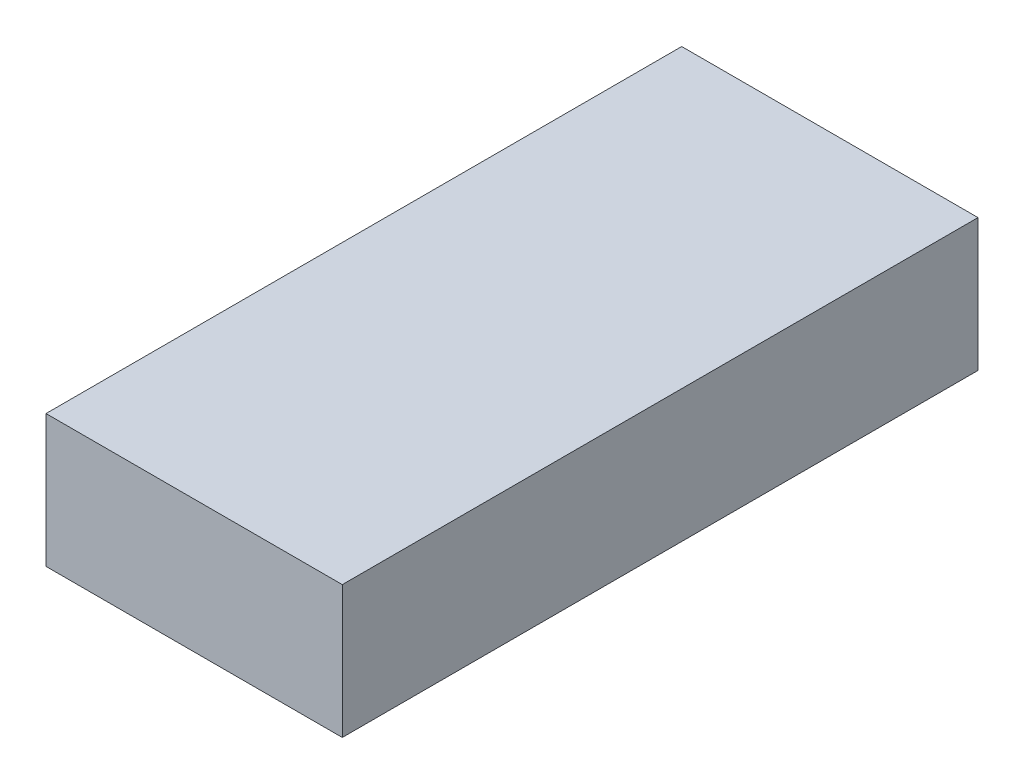
ISO-10303-21;
HEADER;
FILE_DESCRIPTION(('STEP AP214'),'2;1');
FILE_NAME('part.step','',(''),(''),'','','');
FILE_SCHEMA(('AUTOMOTIVE_DESIGN { 1 0 10303 214 1 1 1 1 }'));
ENDSEC;
DATA;
#1=APPLICATION_CONTEXT('core data for automotive mechanical design processes');
#2=APPLICATION_PROTOCOL_DEFINITION('international standard','automotive_design',2000,#1);
#3=PRODUCT_CONTEXT('',#1,'mechanical');
#4=PRODUCT('Part','Part','',(#3));
#5=PRODUCT_RELATED_PRODUCT_CATEGORY('part','',(#4));
#6=PRODUCT_DEFINITION_FORMATION('','',#4);
#7=PRODUCT_DEFINITION_CONTEXT('part definition',#1,'design');
#8=PRODUCT_DEFINITION('design','',#6,#7);
#9=PRODUCT_DEFINITION_SHAPE('','',#8);
#10=(LENGTH_UNIT() NAMED_UNIT(*) SI_UNIT(.MILLI.,.METRE.));
#11=(NAMED_UNIT(*) PLANE_ANGLE_UNIT() SI_UNIT($,.RADIAN.));
#12=(NAMED_UNIT(*) SI_UNIT($,.STERADIAN.) SOLID_ANGLE_UNIT());
#13=UNCERTAINTY_MEASURE_WITH_UNIT(LENGTH_MEASURE(1.E-05),#10,'distance_accuracy_value','');
#14=(GEOMETRIC_REPRESENTATION_CONTEXT(3) GLOBAL_UNCERTAINTY_ASSIGNED_CONTEXT((#13)) GLOBAL_UNIT_ASSIGNED_CONTEXT((#10,
#11,#12)) REPRESENTATION_CONTEXT('',''));
#15=CARTESIAN_POINT('',(0.,0.,0.));
#16=DIRECTION('',(0.,0.,1.));
#17=DIRECTION('',(1.,0.,0.));
#18=AXIS2_PLACEMENT_3D('',#15,#16,#17);
#19=CARTESIAN_POINT('',(18.6436,8.3312,40.));
#20=DIRECTION('',(0.,-1.,0.));
#21=DIRECTION('',(0.,0.,-1.));
#22=AXIS2_PLACEMENT_3D('',#19,#20,#21);
#23=PLANE('',#22);
#24=DIRECTION('',(-1.,0.,0.));
#25=VECTOR('',#24,1.);
#26=CARTESIAN_POINT('',(18.6436,8.3312,-40.));
#27=LINE('',#26,#25);
#28=CARTESIAN_POINT('',(18.6436,8.3312,-40.));
#29=VERTEX_POINT('',#28);
#30=CARTESIAN_POINT('',(-18.6436,8.3312,-40.));
#31=VERTEX_POINT('',#30);
#32=EDGE_CURVE('E102',#29,#31,#27,.T.);
#33=ORIENTED_EDGE('',*,*,#32,.T.);
#34=DIRECTION('',(0.,0.,-1.));
#35=VECTOR('',#34,1.);
#36=CARTESIAN_POINT('',(-18.6436,8.3312,40.));
#37=LINE('',#36,#35);
#38=CARTESIAN_POINT('',(-18.6436,8.3312,40.));
#39=VERTEX_POINT('',#38);
#40=EDGE_CURVE('E11',#39,#31,#37,.T.);
#41=ORIENTED_EDGE('',*,*,#40,.F.);
#42=DIRECTION('',(-1.,0.,0.));
#43=VECTOR('',#42,1.);
#44=CARTESIAN_POINT('',(18.6436,8.3312,40.));
#45=LINE('',#44,#43);
#46=CARTESIAN_POINT('',(18.6436,8.3312,40.));
#47=VERTEX_POINT('',#46);
#48=EDGE_CURVE('E95',#47,#39,#45,.T.);
#49=ORIENTED_EDGE('',*,*,#48,.F.);
#50=DIRECTION('',(0.,0.,-1.));
#51=VECTOR('',#50,1.);
#52=CARTESIAN_POINT('',(18.6436,8.3312,40.));
#53=LINE('',#52,#51);
#54=EDGE_CURVE('E99',#47,#29,#53,.T.);
#55=ORIENTED_EDGE('',*,*,#54,.T.);
#56=EDGE_LOOP('',(#33,#41,#49,#55));
#57=FACE_BOUND('',#56,.T.);
#58=ADVANCED_FACE('F41',(#57),#23,.F.);
#59=CARTESIAN_POINT('',(-18.6436,-8.3312,40.));
#60=DIRECTION('',(1.,0.,0.));
#61=DIRECTION('',(0.,0.,-1.));
#62=AXIS2_PLACEMENT_3D('',#59,#60,#61);
#63=PLANE('',#62);
#64=DIRECTION('',(0.,-1.,0.));
#65=VECTOR('',#64,1.);
#66=CARTESIAN_POINT('',(-18.6436,-8.3312,-40.));
#67=LINE('',#66,#65);
#68=CARTESIAN_POINT('',(-18.6436,-8.3312,-40.));
#69=VERTEX_POINT('',#68);
#70=EDGE_CURVE('E96',#31,#69,#67,.T.);
#71=ORIENTED_EDGE('',*,*,#70,.T.);
#72=DIRECTION('',(0.,0.,-1.));
#73=VECTOR('',#72,1.);
#74=CARTESIAN_POINT('',(-18.6436,-8.3312,40.));
#75=LINE('',#74,#73);
#76=CARTESIAN_POINT('',(-18.6436,-8.3312,40.));
#77=VERTEX_POINT('',#76);
#78=EDGE_CURVE('E47',#77,#69,#75,.T.);
#79=ORIENTED_EDGE('',*,*,#78,.F.);
#80=DIRECTION('',(0.,-1.,0.));
#81=VECTOR('',#80,1.);
#82=CARTESIAN_POINT('',(-18.6436,-8.3312,40.));
#83=LINE('',#82,#81);
#84=EDGE_CURVE('E87',#39,#77,#83,.T.);
#85=ORIENTED_EDGE('',*,*,#84,.F.);
#86=ORIENTED_EDGE('',*,*,#40,.T.);
#87=EDGE_LOOP('',(#71,#79,#85,#86));
#88=FACE_BOUND('',#87,.T.);
#89=ADVANCED_FACE('F92',(#88),#63,.F.);
#90=CARTESIAN_POINT('',(18.6436,-8.3312,40.));
#91=DIRECTION('',(0.,1.,0.));
#92=DIRECTION('',(0.,0.,1.));
#93=AXIS2_PLACEMENT_3D('',#90,#91,#92);
#94=PLANE('',#93);
#95=DIRECTION('',(1.,0.,0.));
#96=VECTOR('',#95,1.);
#97=CARTESIAN_POINT('',(18.6436,-8.3312,-40.));
#98=LINE('',#97,#96);
#99=CARTESIAN_POINT('',(18.6436,-8.3312,-40.));
#100=VERTEX_POINT('',#99);
#101=EDGE_CURVE('E74',#69,#100,#98,.T.);
#102=ORIENTED_EDGE('',*,*,#101,.T.);
#103=DIRECTION('',(0.,0.,-1.));
#104=VECTOR('',#103,1.);
#105=CARTESIAN_POINT('',(18.6436,-8.3312,40.));
#106=LINE('',#105,#104);
#107=CARTESIAN_POINT('',(18.6436,-8.3312,40.));
#108=VERTEX_POINT('',#107);
#109=EDGE_CURVE('E100',#108,#100,#106,.T.);
#110=ORIENTED_EDGE('',*,*,#109,.F.);
#111=DIRECTION('',(1.,0.,0.));
#112=VECTOR('',#111,1.);
#113=CARTESIAN_POINT('',(18.6436,-8.3312,40.));
#114=LINE('',#113,#112);
#115=EDGE_CURVE('E89',#77,#108,#114,.T.);
#116=ORIENTED_EDGE('',*,*,#115,.F.);
#117=ORIENTED_EDGE('',*,*,#78,.T.);
#118=EDGE_LOOP('',(#102,#110,#116,#117));
#119=FACE_BOUND('',#118,.T.);
#120=ADVANCED_FACE('F98',(#119),#94,.F.);
#121=CARTESIAN_POINT('',(18.6436,-8.3312,40.));
#122=DIRECTION('',(-1.,0.,0.));
#123=DIRECTION('',(0.,0.,1.));
#124=AXIS2_PLACEMENT_3D('',#121,#122,#123);
#125=PLANE('',#124);
#126=DIRECTION('',(0.,1.,0.));
#127=VECTOR('',#126,1.);
#128=CARTESIAN_POINT('',(18.6436,-8.3312,-40.));
#129=LINE('',#128,#127);
#130=EDGE_CURVE('E77',#100,#29,#129,.T.);
#131=ORIENTED_EDGE('',*,*,#130,.T.);
#132=ORIENTED_EDGE('',*,*,#54,.F.);
#133=DIRECTION('',(0.,1.,0.));
#134=VECTOR('',#133,1.);
#135=CARTESIAN_POINT('',(18.6436,-8.3312,40.));
#136=LINE('',#135,#134);
#137=EDGE_CURVE('E60',#108,#47,#136,.T.);
#138=ORIENTED_EDGE('',*,*,#137,.F.);
#139=ORIENTED_EDGE('',*,*,#109,.T.);
#140=EDGE_LOOP('',(#131,#132,#138,#139));
#141=FACE_BOUND('',#140,.T.);
#142=ADVANCED_FACE('F112',(#141),#125,.F.);
#143=CARTESIAN_POINT('',(0.,0.,40.));
#144=DIRECTION('',(0.,0.,-1.));
#145=DIRECTION('',(-1.,0.,0.));
#146=AXIS2_PLACEMENT_3D('',#143,#144,#145);
#147=PLANE('',#146);
#148=ORIENTED_EDGE('',*,*,#48,.T.);
#149=ORIENTED_EDGE('',*,*,#84,.T.);
#150=ORIENTED_EDGE('',*,*,#115,.T.);
#151=ORIENTED_EDGE('',*,*,#137,.T.);
#152=EDGE_LOOP('',(#148,#149,#150,#151));
#153=FACE_BOUND('',#152,.T.);
#154=ADVANCED_FACE('F86',(#153),#147,.F.);
#155=CARTESIAN_POINT('',(0.,0.,-40.));
#156=DIRECTION('',(0.,0.,-1.));
#157=DIRECTION('',(-1.,0.,0.));
#158=AXIS2_PLACEMENT_3D('',#155,#156,#157);
#159=PLANE('',#158);
#160=ORIENTED_EDGE('',*,*,#32,.F.);
#161=ORIENTED_EDGE('',*,*,#130,.F.);
#162=ORIENTED_EDGE('',*,*,#101,.F.);
#163=ORIENTED_EDGE('',*,*,#70,.F.);
#164=EDGE_LOOP('',(#160,#161,#162,#163));
#165=FACE_BOUND('',#164,.T.);
#166=ADVANCED_FACE('F111',(#165),#159,.T.);
#167=CLOSED_SHELL('',(#58,#89,#120,#142,#154,#166));
#168=MANIFOLD_SOLID_BREP('B2',#167);
#169=ADVANCED_BREP_SHAPE_REPRESENTATION('',(#18,#168),#14);
#170=SHAPE_DEFINITION_REPRESENTATION(#9,#169);
ENDSEC;
END-ISO-10303-21;
